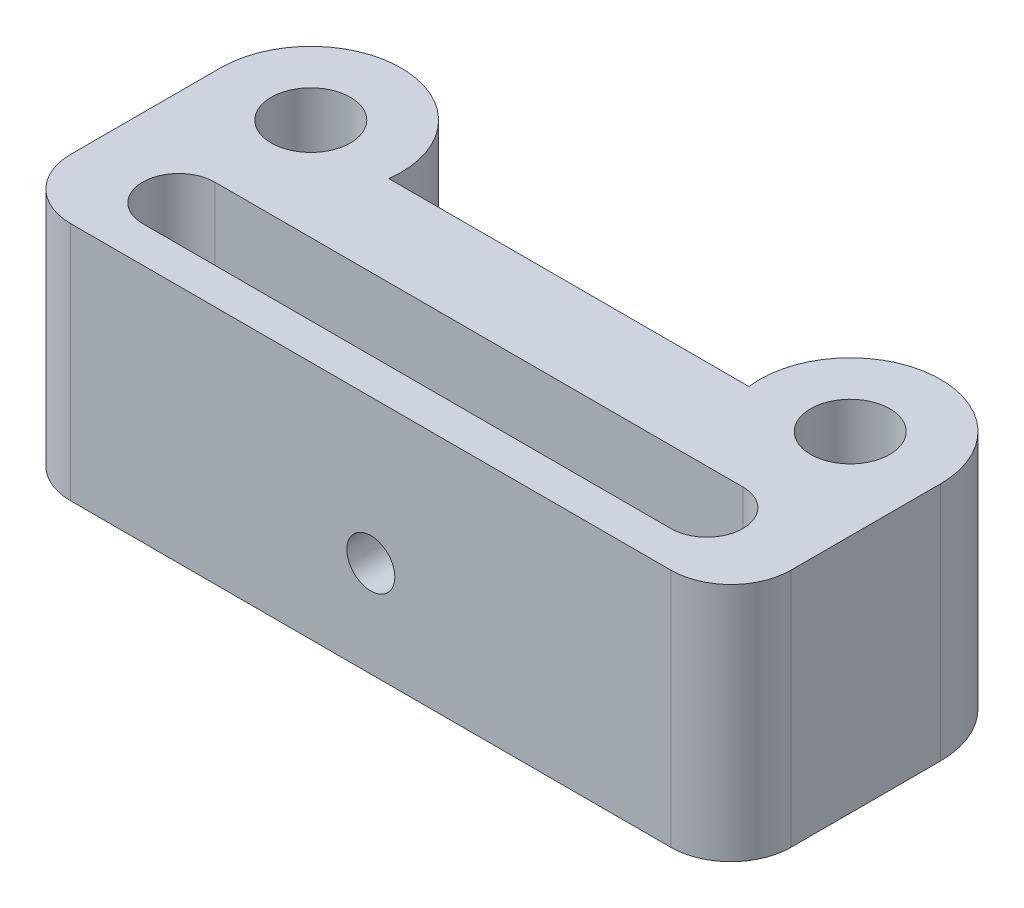
ISO-10303-21;
HEADER;
FILE_DESCRIPTION(('STEP AP214'),'2;1');
FILE_NAME('part.step','',(''),(''),'','','');
FILE_SCHEMA(('AUTOMOTIVE_DESIGN { 1 0 10303 214 1 1 1 1 }'));
ENDSEC;
DATA;
#1=APPLICATION_CONTEXT('core data for automotive mechanical design processes');
#2=APPLICATION_PROTOCOL_DEFINITION('international standard','automotive_design',2000,#1);
#3=PRODUCT_CONTEXT('',#1,'mechanical');
#4=PRODUCT('Part','Part','',(#3));
#5=PRODUCT_RELATED_PRODUCT_CATEGORY('part','',(#4));
#6=PRODUCT_DEFINITION_FORMATION('','',#4);
#7=PRODUCT_DEFINITION_CONTEXT('part definition',#1,'design');
#8=PRODUCT_DEFINITION('design','',#6,#7);
#9=PRODUCT_DEFINITION_SHAPE('','',#8);
#10=(LENGTH_UNIT() NAMED_UNIT(*) SI_UNIT(.MILLI.,.METRE.));
#11=(NAMED_UNIT(*) PLANE_ANGLE_UNIT() SI_UNIT($,.RADIAN.));
#12=(NAMED_UNIT(*) SI_UNIT($,.STERADIAN.) SOLID_ANGLE_UNIT());
#13=UNCERTAINTY_MEASURE_WITH_UNIT(LENGTH_MEASURE(1.E-05),#10,'distance_accuracy_value','');
#14=(GEOMETRIC_REPRESENTATION_CONTEXT(3) GLOBAL_UNCERTAINTY_ASSIGNED_CONTEXT((#13)) GLOBAL_UNIT_ASSIGNED_CONTEXT((#10,
#11,#12)) REPRESENTATION_CONTEXT('',''));
#15=CARTESIAN_POINT('',(0.,0.,0.));
#16=DIRECTION('',(0.,0.,1.));
#17=DIRECTION('',(1.,0.,0.));
#18=AXIS2_PLACEMENT_3D('',#15,#16,#17);
#19=CARTESIAN_POINT('',(-22.4687194226713,0.,-17.4687194226713));
#20=DIRECTION('',(0.,-1.,0.));
#21=DIRECTION('',(0.,0.,-1.));
#22=AXIS2_PLACEMENT_3D('',#19,#20,#21);
#23=PLANE('',#22);
#24=DIRECTION('',(-1.,0.,0.));
#25=VECTOR('',#24,1.);
#26=CARTESIAN_POINT('',(22.,0.,-8.99999999999999));
#27=LINE('',#26,#25);
#28=CARTESIAN_POINT('',(22.,0.,-8.99999999999999));
#29=VERTEX_POINT('',#28);
#30=CARTESIAN_POINT('',(-22.,0.,-8.99999999999999));
#31=VERTEX_POINT('',#30);
#32=EDGE_CURVE('E137',#29,#31,#27,.T.);
#33=ORIENTED_EDGE('',*,*,#32,.T.);
#34=CARTESIAN_POINT('',(-22.,0.,-5.99999999999999));
#35=DIRECTION('',(0.,1.,0.));
#36=DIRECTION('',(0.,0.,-1.));
#37=AXIS2_PLACEMENT_3D('',#34,#35,#36);
#38=CIRCLE('',#37,3.);
#39=CARTESIAN_POINT('',(-22.,0.,-2.99999999999999));
#40=VERTEX_POINT('',#39);
#41=EDGE_CURVE('E157',#31,#40,#38,.T.);
#42=ORIENTED_EDGE('',*,*,#41,.T.);
#43=DIRECTION('',(1.,0.,0.));
#44=VECTOR('',#43,1.);
#45=CARTESIAN_POINT('',(22.,0.,-2.99999999999999));
#46=LINE('',#45,#44);
#47=CARTESIAN_POINT('',(22.,0.,-2.99999999999999));
#48=VERTEX_POINT('',#47);
#49=EDGE_CURVE('E143',#40,#48,#46,.T.);
#50=ORIENTED_EDGE('',*,*,#49,.T.);
#51=CARTESIAN_POINT('',(22.,0.,-5.99999999999999));
#52=DIRECTION('',(0.,1.,0.));
#53=DIRECTION('',(0.,0.,1.));
#54=AXIS2_PLACEMENT_3D('',#51,#52,#53);
#55=CIRCLE('',#54,3.);
#56=EDGE_CURVE('E161',#48,#29,#55,.T.);
#57=ORIENTED_EDGE('',*,*,#56,.T.);
#58=EDGE_LOOP('',(#33,#42,#50,#57));
#59=FACE_BOUND('',#58,.T.);
#60=DIRECTION('',(0.,0.,-1.));
#61=VECTOR('',#60,1.);
#62=CARTESIAN_POINT('',(30.,0.,0.));
#63=LINE('',#62,#61);
#64=CARTESIAN_POINT('',(30.,0.,-5.));
#65=VERTEX_POINT('',#64);
#66=CARTESIAN_POINT('',(30.,0.,-17.4687194226713));
#67=VERTEX_POINT('',#66);
#68=EDGE_CURVE('E187',#65,#67,#63,.T.);
#69=ORIENTED_EDGE('',*,*,#68,.F.);
#70=CARTESIAN_POINT('',(25.,0.,-5.));
#71=DIRECTION('',(0.,-1.,0.));
#72=DIRECTION('',(0.,0.,-1.));
#73=AXIS2_PLACEMENT_3D('',#70,#71,#72);
#74=CIRCLE('',#73,5.);
#75=CARTESIAN_POINT('',(25.,0.,0.));
#76=VERTEX_POINT('',#75);
#77=EDGE_CURVE('E215',#65,#76,#74,.T.);
#78=ORIENTED_EDGE('',*,*,#77,.T.);
#79=DIRECTION('',(1.,0.,0.));
#80=VECTOR('',#79,1.);
#81=CARTESIAN_POINT('',(30.,0.,0.));
#82=LINE('',#81,#80);
#83=CARTESIAN_POINT('',(-25.,0.,0.));
#84=VERTEX_POINT('',#83);
#85=EDGE_CURVE('E185',#84,#76,#82,.T.);
#86=ORIENTED_EDGE('',*,*,#85,.F.);
#87=CARTESIAN_POINT('',(-25.,0.,-5.));
#88=DIRECTION('',(0.,-1.,0.));
#89=DIRECTION('',(0.,0.,-1.));
#90=AXIS2_PLACEMENT_3D('',#87,#88,#89);
#91=CIRCLE('',#90,5.);
#92=CARTESIAN_POINT('',(-30.,0.,-5.));
#93=VERTEX_POINT('',#92);
#94=EDGE_CURVE('E213',#84,#93,#91,.T.);
#95=ORIENTED_EDGE('',*,*,#94,.T.);
#96=DIRECTION('',(0.,0.,1.));
#97=VECTOR('',#96,1.);
#98=CARTESIAN_POINT('',(-30.,0.,0.));
#99=LINE('',#98,#97);
#100=CARTESIAN_POINT('',(-30.,0.,-17.4687194226713));
#101=VERTEX_POINT('',#100);
#102=EDGE_CURVE('E144',#101,#93,#99,.T.);
#103=ORIENTED_EDGE('',*,*,#102,.F.);
#104=CARTESIAN_POINT('',(-22.4687194226713,0.,-17.4687194226713));
#105=DIRECTION('',(0.,1.,0.));
#106=DIRECTION('',(0.,0.,-1.));
#107=AXIS2_PLACEMENT_3D('',#104,#105,#106);
#108=CIRCLE('',#107,7.53128057732869);
#109=CARTESIAN_POINT('',(-15.,0.,-16.5));
#110=VERTEX_POINT('',#109);
#111=EDGE_CURVE('E173',#110,#101,#108,.T.);
#112=ORIENTED_EDGE('',*,*,#111,.F.);
#113=DIRECTION('',(-1.,0.,0.));
#114=VECTOR('',#113,1.);
#115=CARTESIAN_POINT('',(-15.,0.,-16.5));
#116=LINE('',#115,#114);
#117=CARTESIAN_POINT('',(15.,0.,-16.5));
#118=VERTEX_POINT('',#117);
#119=EDGE_CURVE('E191',#118,#110,#116,.T.);
#120=ORIENTED_EDGE('',*,*,#119,.F.);
#121=CARTESIAN_POINT('',(22.4687194226713,0.,-17.4687194226713));
#122=DIRECTION('',(0.,1.,0.));
#123=DIRECTION('',(0.,0.,1.));
#124=AXIS2_PLACEMENT_3D('',#121,#122,#123);
#125=CIRCLE('',#124,7.53128057732869);
#126=EDGE_CURVE('E189',#67,#118,#125,.T.);
#127=ORIENTED_EDGE('',*,*,#126,.F.);
#128=EDGE_LOOP('',(#69,#78,#86,#95,#103,#112,#120,#127));
#129=FACE_BOUND('',#128,.T.);
#130=CARTESIAN_POINT('',(22.4687194226713,0.,-17.4687194226713));
#131=DIRECTION('',(0.,1.,0.));
#132=DIRECTION('',(0.,0.,1.));
#133=AXIS2_PLACEMENT_3D('',#130,#131,#132);
#134=CIRCLE('',#133,3.3);
#135=CARTESIAN_POINT('',(22.4687194226713,0.,-14.1687194226713));
#136=VERTEX_POINT('',#135);
#137=EDGE_CURVE('E320',#136,#136,#134,.T.);
#138=ORIENTED_EDGE('',*,*,#137,.T.);
#139=EDGE_LOOP('',(#138));
#140=FACE_BOUND('',#139,.T.);
#141=CARTESIAN_POINT('',(-22.4687194226713,0.,-17.4687194226713));
#142=DIRECTION('',(0.,1.,0.));
#143=DIRECTION('',(0.,0.,1.));
#144=AXIS2_PLACEMENT_3D('',#141,#142,#143);
#145=CIRCLE('',#144,3.3);
#146=CARTESIAN_POINT('',(-22.4687194226713,0.,-14.1687194226713));
#147=VERTEX_POINT('',#146);
#148=EDGE_CURVE('E310',#147,#147,#145,.T.);
#149=ORIENTED_EDGE('',*,*,#148,.T.);
#150=EDGE_LOOP('',(#149));
#151=FACE_BOUND('',#150,.T.);
#152=ADVANCED_FACE('F34',(#59,#129,#140,#151),#23,.T.);
#153=CARTESIAN_POINT('',(-22.4687194226713,20.,-17.4687194226713));
#154=DIRECTION('',(0.,-1.,0.));
#155=DIRECTION('',(0.,0.,-1.));
#156=AXIS2_PLACEMENT_3D('',#153,#154,#155);
#157=PLANE('',#156);
#158=CARTESIAN_POINT('',(-22.4687194226713,20.,-17.4687194226713));
#159=DIRECTION('',(0.,1.,0.));
#160=DIRECTION('',(0.,0.,1.));
#161=AXIS2_PLACEMENT_3D('',#158,#159,#160);
#162=CIRCLE('',#161,3.29999999999999);
#163=CARTESIAN_POINT('',(-22.4687194226713,20.,-14.1687194226713));
#164=VERTEX_POINT('',#163);
#165=EDGE_CURVE('E313',#164,#164,#162,.T.);
#166=ORIENTED_EDGE('',*,*,#165,.F.);
#167=EDGE_LOOP('',(#166));
#168=FACE_BOUND('',#167,.T.);
#169=CARTESIAN_POINT('',(22.4687194226713,20.,-17.4687194226713));
#170=DIRECTION('',(0.,1.,0.));
#171=DIRECTION('',(0.,0.,1.));
#172=AXIS2_PLACEMENT_3D('',#169,#170,#171);
#173=CIRCLE('',#172,3.29999999999999);
#174=CARTESIAN_POINT('',(22.4687194226713,20.,-14.1687194226713));
#175=VERTEX_POINT('',#174);
#176=EDGE_CURVE('E315',#175,#175,#173,.T.);
#177=ORIENTED_EDGE('',*,*,#176,.F.);
#178=EDGE_LOOP('',(#177));
#179=FACE_BOUND('',#178,.T.);
#180=DIRECTION('',(1.,0.,0.));
#181=VECTOR('',#180,1.);
#182=CARTESIAN_POINT('',(30.,20.,0.));
#183=LINE('',#182,#181);
#184=CARTESIAN_POINT('',(-25.,20.,0.));
#185=VERTEX_POINT('',#184);
#186=CARTESIAN_POINT('',(25.,20.,0.));
#187=VERTEX_POINT('',#186);
#188=EDGE_CURVE('E172',#185,#187,#183,.T.);
#189=ORIENTED_EDGE('',*,*,#188,.T.);
#190=CARTESIAN_POINT('',(25.,20.,-5.));
#191=DIRECTION('',(0.,-1.,0.));
#192=DIRECTION('',(0.,0.,-1.));
#193=AXIS2_PLACEMENT_3D('',#190,#191,#192);
#194=CIRCLE('',#193,5.);
#195=CARTESIAN_POINT('',(30.,20.,-5.));
#196=VERTEX_POINT('',#195);
#197=EDGE_CURVE('E42',#187,#196,#194,.F.);
#198=ORIENTED_EDGE('',*,*,#197,.T.);
#199=DIRECTION('',(0.,0.,-1.));
#200=VECTOR('',#199,1.);
#201=CARTESIAN_POINT('',(30.,20.,0.));
#202=LINE('',#201,#200);
#203=CARTESIAN_POINT('',(30.,20.,-17.4687194226713));
#204=VERTEX_POINT('',#203);
#205=EDGE_CURVE('E175',#196,#204,#202,.T.);
#206=ORIENTED_EDGE('',*,*,#205,.T.);
#207=CARTESIAN_POINT('',(22.4687194226713,20.,-17.4687194226713));
#208=DIRECTION('',(0.,1.,0.));
#209=DIRECTION('',(0.,0.,1.));
#210=AXIS2_PLACEMENT_3D('',#207,#208,#209);
#211=CIRCLE('',#210,7.53128057732869);
#212=CARTESIAN_POINT('',(15.,20.,-16.5));
#213=VERTEX_POINT('',#212);
#214=EDGE_CURVE('E177',#204,#213,#211,.T.);
#215=ORIENTED_EDGE('',*,*,#214,.T.);
#216=DIRECTION('',(-1.,0.,0.));
#217=VECTOR('',#216,1.);
#218=CARTESIAN_POINT('',(-15.,20.,-16.5));
#219=LINE('',#218,#217);
#220=CARTESIAN_POINT('',(-15.,20.,-16.5));
#221=VERTEX_POINT('',#220);
#222=EDGE_CURVE('E179',#213,#221,#219,.T.);
#223=ORIENTED_EDGE('',*,*,#222,.T.);
#224=CARTESIAN_POINT('',(-22.4687194226713,20.,-17.4687194226713));
#225=DIRECTION('',(0.,1.,0.));
#226=DIRECTION('',(0.,0.,-1.));
#227=AXIS2_PLACEMENT_3D('',#224,#225,#226);
#228=CIRCLE('',#227,7.53128057732869);
#229=CARTESIAN_POINT('',(-30.,20.,-17.4687194226713));
#230=VERTEX_POINT('',#229);
#231=EDGE_CURVE('E181',#221,#230,#228,.T.);
#232=ORIENTED_EDGE('',*,*,#231,.T.);
#233=DIRECTION('',(0.,0.,1.));
#234=VECTOR('',#233,1.);
#235=CARTESIAN_POINT('',(-30.,20.,0.));
#236=LINE('',#235,#234);
#237=CARTESIAN_POINT('',(-30.,20.,-5.));
#238=VERTEX_POINT('',#237);
#239=EDGE_CURVE('E170',#230,#238,#236,.T.);
#240=ORIENTED_EDGE('',*,*,#239,.T.);
#241=CARTESIAN_POINT('',(-25.,20.,-5.));
#242=DIRECTION('',(0.,-1.,0.));
#243=DIRECTION('',(0.,0.,-1.));
#244=AXIS2_PLACEMENT_3D('',#241,#242,#243);
#245=CIRCLE('',#244,5.);
#246=EDGE_CURVE('E221',#238,#185,#245,.F.);
#247=ORIENTED_EDGE('',*,*,#246,.T.);
#248=EDGE_LOOP('',(#189,#198,#206,#215,#223,#232,#240,#247));
#249=FACE_BOUND('',#248,.T.);
#250=CARTESIAN_POINT('',(-22.,20.,-5.99999999999999));
#251=DIRECTION('',(0.,1.,0.));
#252=DIRECTION('',(0.,0.,-1.));
#253=AXIS2_PLACEMENT_3D('',#250,#251,#252);
#254=CIRCLE('',#253,3.);
#255=CARTESIAN_POINT('',(-22.,20.,-8.99999999999999));
#256=VERTEX_POINT('',#255);
#257=CARTESIAN_POINT('',(-22.,20.,-2.99999999999999));
#258=VERTEX_POINT('',#257);
#259=EDGE_CURVE('E126',#256,#258,#254,.T.);
#260=ORIENTED_EDGE('',*,*,#259,.F.);
#261=DIRECTION('',(-1.,0.,0.));
#262=VECTOR('',#261,1.);
#263=CARTESIAN_POINT('',(22.,20.,-8.99999999999999));
#264=LINE('',#263,#262);
#265=CARTESIAN_POINT('',(22.,20.,-8.99999999999999));
#266=VERTEX_POINT('',#265);
#267=EDGE_CURVE('E152',#266,#256,#264,.T.);
#268=ORIENTED_EDGE('',*,*,#267,.F.);
#269=CARTESIAN_POINT('',(22.,20.,-5.99999999999999));
#270=DIRECTION('',(0.,1.,0.));
#271=DIRECTION('',(0.,0.,1.));
#272=AXIS2_PLACEMENT_3D('',#269,#270,#271);
#273=CIRCLE('',#272,3.);
#274=CARTESIAN_POINT('',(22.,20.,-2.99999999999999));
#275=VERTEX_POINT('',#274);
#276=EDGE_CURVE('E150',#275,#266,#273,.T.);
#277=ORIENTED_EDGE('',*,*,#276,.F.);
#278=DIRECTION('',(1.,0.,0.));
#279=VECTOR('',#278,1.);
#280=CARTESIAN_POINT('',(22.,20.,-2.99999999999999));
#281=LINE('',#280,#279);
#282=EDGE_CURVE('E136',#258,#275,#281,.T.);
#283=ORIENTED_EDGE('',*,*,#282,.F.);
#284=EDGE_LOOP('',(#260,#268,#277,#283));
#285=FACE_BOUND('',#284,.T.);
#286=ADVANCED_FACE('F148',(#168,#179,#249,#285),#157,.F.);
#287=CARTESIAN_POINT('',(-30.,20.,0.));
#288=DIRECTION('',(1.,0.,0.));
#289=DIRECTION('',(0.,0.,-1.));
#290=AXIS2_PLACEMENT_3D('',#287,#288,#289);
#291=PLANE('',#290);
#292=ORIENTED_EDGE('',*,*,#102,.T.);
#293=DIRECTION('',(0.,-1.,0.));
#294=VECTOR('',#293,1.);
#295=CARTESIAN_POINT('',(-30.,20.,-5.));
#296=LINE('',#295,#294);
#297=EDGE_CURVE('E11',#93,#238,#296,.F.);
#298=ORIENTED_EDGE('',*,*,#297,.T.);
#299=ORIENTED_EDGE('',*,*,#239,.F.);
#300=DIRECTION('',(0.,-1.,0.));
#301=VECTOR('',#300,1.);
#302=CARTESIAN_POINT('',(-30.,20.,-17.4687194226713));
#303=LINE('',#302,#301);
#304=EDGE_CURVE('E183',#230,#101,#303,.T.);
#305=ORIENTED_EDGE('',*,*,#304,.T.);
#306=EDGE_LOOP('',(#292,#298,#299,#305));
#307=FACE_BOUND('',#306,.T.);
#308=ADVANCED_FACE('F243',(#307),#291,.F.);
#309=CARTESIAN_POINT('',(30.,20.,0.));
#310=DIRECTION('',(0.,0.,-1.));
#311=DIRECTION('',(-1.,0.,0.));
#312=AXIS2_PLACEMENT_3D('',#309,#310,#311);
#313=PLANE('',#312);
#314=CARTESIAN_POINT('',(0.,8.,0.));
#315=DIRECTION('',(0.,0.,1.));
#316=DIRECTION('',(1.,0.,0.));
#317=AXIS2_PLACEMENT_3D('',#314,#315,#316);
#318=CIRCLE('',#317,2.);
#319=CARTESIAN_POINT('',(2.,8.,0.));
#320=VERTEX_POINT('',#319);
#321=EDGE_CURVE('E210',#320,#320,#318,.T.);
#322=ORIENTED_EDGE('',*,*,#321,.F.);
#323=EDGE_LOOP('',(#322));
#324=FACE_BOUND('',#323,.T.);
#325=ORIENTED_EDGE('',*,*,#85,.T.);
#326=DIRECTION('',(0.,-1.,0.));
#327=VECTOR('',#326,1.);
#328=CARTESIAN_POINT('',(25.,20.,0.));
#329=LINE('',#328,#327);
#330=EDGE_CURVE('E55',#76,#187,#329,.F.);
#331=ORIENTED_EDGE('',*,*,#330,.T.);
#332=ORIENTED_EDGE('',*,*,#188,.F.);
#333=DIRECTION('',(0.,-1.,0.));
#334=VECTOR('',#333,1.);
#335=CARTESIAN_POINT('',(-25.,20.,0.));
#336=LINE('',#335,#334);
#337=EDGE_CURVE('E217',#185,#84,#336,.T.);
#338=ORIENTED_EDGE('',*,*,#337,.T.);
#339=EDGE_LOOP('',(#325,#331,#332,#338));
#340=FACE_BOUND('',#339,.T.);
#341=ADVANCED_FACE('F237',(#324,#340),#313,.F.);
#342=CARTESIAN_POINT('',(30.,20.,0.));
#343=DIRECTION('',(-1.,0.,0.));
#344=DIRECTION('',(0.,0.,1.));
#345=AXIS2_PLACEMENT_3D('',#342,#343,#344);
#346=PLANE('',#345);
#347=ORIENTED_EDGE('',*,*,#205,.F.);
#348=DIRECTION('',(0.,-1.,0.));
#349=VECTOR('',#348,1.);
#350=CARTESIAN_POINT('',(30.,20.,-5.));
#351=LINE('',#350,#349);
#352=EDGE_CURVE('E205',#196,#65,#351,.T.);
#353=ORIENTED_EDGE('',*,*,#352,.T.);
#354=ORIENTED_EDGE('',*,*,#68,.T.);
#355=DIRECTION('',(0.,-1.,0.));
#356=VECTOR('',#355,1.);
#357=CARTESIAN_POINT('',(30.,20.,-17.4687194226713));
#358=LINE('',#357,#356);
#359=EDGE_CURVE('E202',#204,#67,#358,.T.);
#360=ORIENTED_EDGE('',*,*,#359,.F.);
#361=EDGE_LOOP('',(#347,#353,#354,#360));
#362=FACE_BOUND('',#361,.T.);
#363=ADVANCED_FACE('F229',(#362),#346,.F.);
#364=CARTESIAN_POINT('',(22.4687194226713,20.,-17.4687194226713));
#365=DIRECTION('',(0.,-1.,0.));
#366=DIRECTION('',(0.,0.,-1.));
#367=AXIS2_PLACEMENT_3D('',#364,#365,#366);
#368=CYLINDRICAL_SURFACE('',#367,7.53128057732869);
#369=ORIENTED_EDGE('',*,*,#126,.T.);
#370=DIRECTION('',(0.,-1.,0.));
#371=VECTOR('',#370,1.);
#372=CARTESIAN_POINT('',(15.,20.,-16.5));
#373=LINE('',#372,#371);
#374=EDGE_CURVE('E199',#213,#118,#373,.T.);
#375=ORIENTED_EDGE('',*,*,#374,.F.);
#376=ORIENTED_EDGE('',*,*,#214,.F.);
#377=ORIENTED_EDGE('',*,*,#359,.T.);
#378=EDGE_LOOP('',(#369,#375,#376,#377));
#379=FACE_BOUND('',#378,.T.);
#380=ADVANCED_FACE('F255',(#379),#368,.T.);
#381=CARTESIAN_POINT('',(-15.,20.,-16.5));
#382=DIRECTION('',(0.,0.,1.));
#383=DIRECTION('',(1.,0.,0.));
#384=AXIS2_PLACEMENT_3D('',#381,#382,#383);
#385=PLANE('',#384);
#386=CARTESIAN_POINT('',(0.,8.,-16.5));
#387=DIRECTION('',(0.,0.,1.));
#388=DIRECTION('',(1.,0.,0.));
#389=AXIS2_PLACEMENT_3D('',#386,#387,#388);
#390=CIRCLE('',#389,2.);
#391=CARTESIAN_POINT('',(2.,8.,-16.5));
#392=VERTEX_POINT('',#391);
#393=EDGE_CURVE('E159',#392,#392,#390,.T.);
#394=ORIENTED_EDGE('',*,*,#393,.T.);
#395=EDGE_LOOP('',(#394));
#396=FACE_BOUND('',#395,.T.);
#397=ORIENTED_EDGE('',*,*,#119,.T.);
#398=DIRECTION('',(0.,-1.,0.));
#399=VECTOR('',#398,1.);
#400=CARTESIAN_POINT('',(-15.,20.,-16.5));
#401=LINE('',#400,#399);
#402=EDGE_CURVE('E196',#221,#110,#401,.T.);
#403=ORIENTED_EDGE('',*,*,#402,.F.);
#404=ORIENTED_EDGE('',*,*,#222,.F.);
#405=ORIENTED_EDGE('',*,*,#374,.T.);
#406=EDGE_LOOP('',(#397,#403,#404,#405));
#407=FACE_BOUND('',#406,.T.);
#408=ADVANCED_FACE('F251',(#396,#407),#385,.F.);
#409=CARTESIAN_POINT('',(-22.4687194226713,20.,-17.4687194226713));
#410=DIRECTION('',(0.,-1.,0.));
#411=DIRECTION('',(0.,0.,-1.));
#412=AXIS2_PLACEMENT_3D('',#409,#410,#411);
#413=CYLINDRICAL_SURFACE('',#412,7.53128057732869);
#414=ORIENTED_EDGE('',*,*,#111,.T.);
#415=ORIENTED_EDGE('',*,*,#304,.F.);
#416=ORIENTED_EDGE('',*,*,#231,.F.);
#417=ORIENTED_EDGE('',*,*,#402,.T.);
#418=EDGE_LOOP('',(#414,#415,#416,#417));
#419=FACE_BOUND('',#418,.T.);
#420=ADVANCED_FACE('F247',(#419),#413,.T.);
#421=CARTESIAN_POINT('',(-22.,20.,-5.99999999999999));
#422=DIRECTION('',(0.,-1.,0.));
#423=DIRECTION('',(0.,0.,-1.));
#424=AXIS2_PLACEMENT_3D('',#421,#422,#423);
#425=CYLINDRICAL_SURFACE('',#424,3.);
#426=ORIENTED_EDGE('',*,*,#41,.F.);
#427=DIRECTION('',(0.,-1.,0.));
#428=VECTOR('',#427,1.);
#429=CARTESIAN_POINT('',(-22.,20.,-8.99999999999999));
#430=LINE('',#429,#428);
#431=EDGE_CURVE('E132',#256,#31,#430,.T.);
#432=ORIENTED_EDGE('',*,*,#431,.F.);
#433=ORIENTED_EDGE('',*,*,#259,.T.);
#434=DIRECTION('',(0.,-1.,0.));
#435=VECTOR('',#434,1.);
#436=CARTESIAN_POINT('',(-22.,20.,-2.99999999999999));
#437=LINE('',#436,#435);
#438=EDGE_CURVE('E129',#258,#40,#437,.T.);
#439=ORIENTED_EDGE('',*,*,#438,.T.);
#440=EDGE_LOOP('',(#426,#432,#433,#439));
#441=FACE_BOUND('',#440,.T.);
#442=ADVANCED_FACE('F128',(#441),#425,.F.);
#443=CARTESIAN_POINT('',(22.,20.,-2.99999999999999));
#444=DIRECTION('',(0.,0.,-1.));
#445=DIRECTION('',(-1.,0.,0.));
#446=AXIS2_PLACEMENT_3D('',#443,#444,#445);
#447=PLANE('',#446);
#448=CARTESIAN_POINT('',(0.,8.,-2.99999999999999));
#449=DIRECTION('',(0.,0.,-1.));
#450=DIRECTION('',(-1.,0.,0.));
#451=AXIS2_PLACEMENT_3D('',#448,#449,#450);
#452=CIRCLE('',#451,2.);
#453=CARTESIAN_POINT('',(-2.,8.,-2.99999999999999));
#454=VERTEX_POINT('',#453);
#455=EDGE_CURVE('E209',#454,#454,#452,.T.);
#456=ORIENTED_EDGE('',*,*,#455,.F.);
#457=EDGE_LOOP('',(#456));
#458=FACE_BOUND('',#457,.T.);
#459=ORIENTED_EDGE('',*,*,#49,.F.);
#460=ORIENTED_EDGE('',*,*,#438,.F.);
#461=ORIENTED_EDGE('',*,*,#282,.T.);
#462=DIRECTION('',(0.,-1.,0.));
#463=VECTOR('',#462,1.);
#464=CARTESIAN_POINT('',(22.,20.,-2.99999999999999));
#465=LINE('',#464,#463);
#466=EDGE_CURVE('E145',#275,#48,#465,.T.);
#467=ORIENTED_EDGE('',*,*,#466,.T.);
#468=EDGE_LOOP('',(#459,#460,#461,#467));
#469=FACE_BOUND('',#468,.T.);
#470=ADVANCED_FACE('F140',(#458,#469),#447,.T.);
#471=CARTESIAN_POINT('',(22.,20.,-5.99999999999999));
#472=DIRECTION('',(0.,-1.,0.));
#473=DIRECTION('',(0.,0.,-1.));
#474=AXIS2_PLACEMENT_3D('',#471,#472,#473);
#475=CYLINDRICAL_SURFACE('',#474,3.);
#476=ORIENTED_EDGE('',*,*,#56,.F.);
#477=ORIENTED_EDGE('',*,*,#466,.F.);
#478=ORIENTED_EDGE('',*,*,#276,.T.);
#479=DIRECTION('',(0.,-1.,0.));
#480=VECTOR('',#479,1.);
#481=CARTESIAN_POINT('',(22.,20.,-8.99999999999999));
#482=LINE('',#481,#480);
#483=EDGE_CURVE('E167',#266,#29,#482,.T.);
#484=ORIENTED_EDGE('',*,*,#483,.T.);
#485=EDGE_LOOP('',(#476,#477,#478,#484));
#486=FACE_BOUND('',#485,.T.);
#487=ADVANCED_FACE('F282',(#486),#475,.F.);
#488=CARTESIAN_POINT('',(22.,20.,-8.99999999999999));
#489=DIRECTION('',(0.,0.,1.));
#490=DIRECTION('',(1.,0.,0.));
#491=AXIS2_PLACEMENT_3D('',#488,#489,#490);
#492=PLANE('',#491);
#493=CARTESIAN_POINT('',(0.,8.,-8.99999999999999));
#494=DIRECTION('',(0.,0.,1.));
#495=DIRECTION('',(1.,0.,0.));
#496=AXIS2_PLACEMENT_3D('',#493,#494,#495);
#497=CIRCLE('',#496,2.);
#498=CARTESIAN_POINT('',(2.,8.,-8.99999999999999));
#499=VERTEX_POINT('',#498);
#500=EDGE_CURVE('E206',#499,#499,#497,.T.);
#501=ORIENTED_EDGE('',*,*,#500,.F.);
#502=EDGE_LOOP('',(#501));
#503=FACE_BOUND('',#502,.T.);
#504=ORIENTED_EDGE('',*,*,#32,.F.);
#505=ORIENTED_EDGE('',*,*,#483,.F.);
#506=ORIENTED_EDGE('',*,*,#267,.T.);
#507=ORIENTED_EDGE('',*,*,#431,.T.);
#508=EDGE_LOOP('',(#504,#505,#506,#507));
#509=FACE_BOUND('',#508,.T.);
#510=ADVANCED_FACE('F288',(#503,#509),#492,.T.);
#511=CARTESIAN_POINT('',(0.,8.,-25.));
#512=DIRECTION('',(0.,0.,1.));
#513=DIRECTION('',(1.,0.,0.));
#514=AXIS2_PLACEMENT_3D('',#511,#512,#513);
#515=CYLINDRICAL_SURFACE('',#514,2.);
#516=ORIENTED_EDGE('',*,*,#500,.T.);
#517=EDGE_LOOP('',(#516));
#518=FACE_BOUND('',#517,.T.);
#519=ORIENTED_EDGE('',*,*,#393,.F.);
#520=EDGE_LOOP('',(#519));
#521=FACE_BOUND('',#520,.T.);
#522=ADVANCED_FACE('F292',(#518,#521),#515,.F.);
#523=ORIENTED_EDGE('',*,*,#455,.T.);
#524=EDGE_LOOP('',(#523));
#525=FACE_BOUND('',#524,.T.);
#526=ORIENTED_EDGE('',*,*,#321,.T.);
#527=EDGE_LOOP('',(#526));
#528=FACE_BOUND('',#527,.T.);
#529=ADVANCED_FACE('F296',(#525,#528),#515,.F.);
#530=CARTESIAN_POINT('',(25.,20.,-5.));
#531=DIRECTION('',(0.,-1.,0.));
#532=DIRECTION('',(0.,0.,-1.));
#533=AXIS2_PLACEMENT_3D('',#530,#531,#532);
#534=CYLINDRICAL_SURFACE('',#533,5.);
#535=ORIENTED_EDGE('',*,*,#197,.F.);
#536=ORIENTED_EDGE('',*,*,#330,.F.);
#537=ORIENTED_EDGE('',*,*,#77,.F.);
#538=ORIENTED_EDGE('',*,*,#352,.F.);
#539=EDGE_LOOP('',(#535,#536,#537,#538));
#540=FACE_BOUND('',#539,.T.);
#541=ADVANCED_FACE('F232',(#540),#534,.T.);
#542=CARTESIAN_POINT('',(-25.,20.,-5.));
#543=DIRECTION('',(0.,-1.,0.));
#544=DIRECTION('',(0.,0.,-1.));
#545=AXIS2_PLACEMENT_3D('',#542,#543,#544);
#546=CYLINDRICAL_SURFACE('',#545,5.);
#547=ORIENTED_EDGE('',*,*,#246,.F.);
#548=ORIENTED_EDGE('',*,*,#297,.F.);
#549=ORIENTED_EDGE('',*,*,#94,.F.);
#550=ORIENTED_EDGE('',*,*,#337,.F.);
#551=EDGE_LOOP('',(#547,#548,#549,#550));
#552=FACE_BOUND('',#551,.T.);
#553=ADVANCED_FACE('F36',(#552),#546,.T.);
#554=CARTESIAN_POINT('',(22.4687194226713,20.,-17.4687194226713));
#555=DIRECTION('',(0.,1.,0.));
#556=DIRECTION('',(0.,0.,1.));
#557=AXIS2_PLACEMENT_3D('',#554,#555,#556);
#558=CYLINDRICAL_SURFACE('',#557,3.29999999999999);
#559=ORIENTED_EDGE('',*,*,#137,.F.);
#560=EDGE_LOOP('',(#559));
#561=FACE_BOUND('',#560,.T.);
#562=ORIENTED_EDGE('',*,*,#176,.T.);
#563=EDGE_LOOP('',(#562));
#564=FACE_BOUND('',#563,.T.);
#565=ADVANCED_FACE('F298',(#561,#564),#558,.F.);
#566=CARTESIAN_POINT('',(-22.4687194226713,20.,-17.4687194226713));
#567=DIRECTION('',(0.,1.,0.));
#568=DIRECTION('',(0.,0.,1.));
#569=AXIS2_PLACEMENT_3D('',#566,#567,#568);
#570=CYLINDRICAL_SURFACE('',#569,3.29999999999999);
#571=ORIENTED_EDGE('',*,*,#148,.F.);
#572=EDGE_LOOP('',(#571));
#573=FACE_BOUND('',#572,.T.);
#574=ORIENTED_EDGE('',*,*,#165,.T.);
#575=EDGE_LOOP('',(#574));
#576=FACE_BOUND('',#575,.T.);
#577=ADVANCED_FACE('F301',(#573,#576),#570,.F.);
#578=CLOSED_SHELL('',(#152,#286,#308,#341,#363,#380,#408,#420,#442,#470,#487,#510,#522,#529,
#541,#553,#565,#577));
#579=MANIFOLD_SOLID_BREP('B2',#578);
#580=ADVANCED_BREP_SHAPE_REPRESENTATION('',(#18,#579),#14);
#581=SHAPE_DEFINITION_REPRESENTATION(#9,#580);
ENDSEC;
END-ISO-10303-21;
